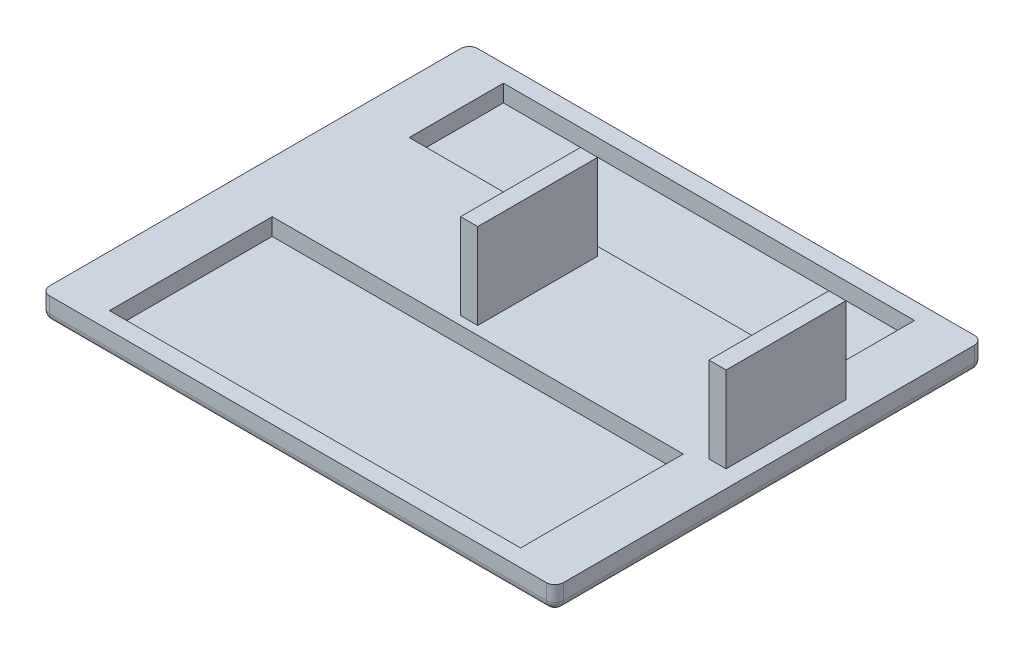
ISO-10303-21;
HEADER;
FILE_DESCRIPTION(('STEP AP214'),'2;1');
FILE_NAME('part.step','',(''),(''),'','','');
FILE_SCHEMA(('AUTOMOTIVE_DESIGN { 1 0 10303 214 1 1 1 1 }'));
ENDSEC;
DATA;
#1=APPLICATION_CONTEXT('core data for automotive mechanical design processes');
#2=APPLICATION_PROTOCOL_DEFINITION('international standard','automotive_design',2000,#1);
#3=PRODUCT_CONTEXT('',#1,'mechanical');
#4=PRODUCT('Part','Part','',(#3));
#5=PRODUCT_RELATED_PRODUCT_CATEGORY('part','',(#4));
#6=PRODUCT_DEFINITION_FORMATION('','',#4);
#7=PRODUCT_DEFINITION_CONTEXT('part definition',#1,'design');
#8=PRODUCT_DEFINITION('design','',#6,#7);
#9=PRODUCT_DEFINITION_SHAPE('','',#8);
#10=(LENGTH_UNIT() NAMED_UNIT(*) SI_UNIT(.MILLI.,.METRE.));
#11=(NAMED_UNIT(*) PLANE_ANGLE_UNIT() SI_UNIT($,.RADIAN.));
#12=(NAMED_UNIT(*) SI_UNIT($,.STERADIAN.) SOLID_ANGLE_UNIT());
#13=UNCERTAINTY_MEASURE_WITH_UNIT(LENGTH_MEASURE(1.E-05),#10,'distance_accuracy_value','');
#14=(GEOMETRIC_REPRESENTATION_CONTEXT(3) GLOBAL_UNCERTAINTY_ASSIGNED_CONTEXT((#13)) GLOBAL_UNIT_ASSIGNED_CONTEXT((#10,
#11,#12)) REPRESENTATION_CONTEXT('',''));
#15=CARTESIAN_POINT('',(0.,0.,0.));
#16=DIRECTION('',(0.,0.,1.));
#17=DIRECTION('',(1.,0.,0.));
#18=AXIS2_PLACEMENT_3D('',#15,#16,#17);
#19=CARTESIAN_POINT('',(0.,14.,0.));
#20=DIRECTION('',(0.,-1.,0.));
#21=DIRECTION('',(0.,0.,-1.));
#22=AXIS2_PLACEMENT_3D('',#19,#20,#21);
#23=PLANE('',#22);
#24=DIRECTION('',(0.,0.,1.));
#25=VECTOR('',#24,1.);
#26=CARTESIAN_POINT('',(130.,14.,-55.));
#27=LINE('',#26,#25);
#28=CARTESIAN_POINT('',(130.,14.,-55.));
#29=VERTEX_POINT('',#28);
#30=CARTESIAN_POINT('',(130.,14.,15.));
#31=VERTEX_POINT('',#30);
#32=EDGE_CURVE('E230',#29,#31,#27,.T.);
#33=ORIENTED_EDGE('',*,*,#32,.F.);
#34=DIRECTION('',(-1.,0.,0.));
#35=VECTOR('',#34,1.);
#36=CARTESIAN_POINT('',(130.,14.,-55.));
#37=LINE('',#36,#35);
#38=CARTESIAN_POINT('',(140.,14.,-55.));
#39=VERTEX_POINT('',#38);
#40=EDGE_CURVE('E243',#39,#29,#37,.T.);
#41=ORIENTED_EDGE('',*,*,#40,.F.);
#42=DIRECTION('',(0.,0.,-1.));
#43=VECTOR('',#42,1.);
#44=CARTESIAN_POINT('',(140.,14.,-55.));
#45=LINE('',#44,#43);
#46=CARTESIAN_POINT('',(140.,14.,15.));
#47=VERTEX_POINT('',#46);
#48=EDGE_CURVE('E252',#47,#39,#45,.T.);
#49=ORIENTED_EDGE('',*,*,#48,.F.);
#50=DIRECTION('',(1.,0.,0.));
#51=VECTOR('',#50,1.);
#52=CARTESIAN_POINT('',(130.,14.,15.));
#53=LINE('',#52,#51);
#54=EDGE_CURVE('E233',#31,#47,#53,.T.);
#55=ORIENTED_EDGE('',*,*,#54,.F.);
#56=EDGE_LOOP('',(#33,#41,#49,#55));
#57=FACE_BOUND('',#56,.T.);
#58=DIRECTION('',(0.,0.,-1.));
#59=VECTOR('',#58,1.);
#60=CARTESIAN_POINT('',(120.,14.,-115.));
#61=LINE('',#60,#59);
#62=CARTESIAN_POINT('',(120.,14.,-60.));
#63=VERTEX_POINT('',#62);
#64=CARTESIAN_POINT('',(120.,14.,-115.));
#65=VERTEX_POINT('',#64);
#66=EDGE_CURVE('E315',#63,#65,#61,.T.);
#67=ORIENTED_EDGE('',*,*,#66,.F.);
#68=DIRECTION('',(-1.,0.,0.));
#69=VECTOR('',#68,1.);
#70=CARTESIAN_POINT('',(-120.,14.,-60.));
#71=LINE('',#70,#69);
#72=CARTESIAN_POINT('',(-120.,14.,-60.));
#73=VERTEX_POINT('',#72);
#74=EDGE_CURVE('E272',#63,#73,#71,.T.);
#75=ORIENTED_EDGE('',*,*,#74,.T.);
#76=DIRECTION('',(0.,0.,1.));
#77=VECTOR('',#76,1.);
#78=CARTESIAN_POINT('',(-120.,14.,-115.));
#79=LINE('',#78,#77);
#80=CARTESIAN_POINT('',(-120.,14.,-115.));
#81=VERTEX_POINT('',#80);
#82=EDGE_CURVE('E310',#81,#73,#79,.T.);
#83=ORIENTED_EDGE('',*,*,#82,.F.);
#84=DIRECTION('',(-1.,0.,0.));
#85=VECTOR('',#84,1.);
#86=CARTESIAN_POINT('',(-120.,14.,-115.));
#87=LINE('',#86,#85);
#88=EDGE_CURVE('E306',#65,#81,#87,.T.);
#89=ORIENTED_EDGE('',*,*,#88,.F.);
#90=EDGE_LOOP('',(#67,#75,#83,#89));
#91=FACE_BOUND('',#90,.T.);
#92=DIRECTION('',(1.,0.,0.));
#93=VECTOR('',#92,1.);
#94=CARTESIAN_POINT('',(-120.,14.,20.));
#95=LINE('',#94,#93);
#96=CARTESIAN_POINT('',(-120.,14.,20.));
#97=VERTEX_POINT('',#96);
#98=CARTESIAN_POINT('',(120.,14.,20.));
#99=VERTEX_POINT('',#98);
#100=EDGE_CURVE('E269',#97,#99,#95,.T.);
#101=ORIENTED_EDGE('',*,*,#100,.T.);
#102=CARTESIAN_POINT('',(120.,14.,115.));
#103=VERTEX_POINT('',#102);
#104=EDGE_CURVE('E295',#103,#99,#61,.T.);
#105=ORIENTED_EDGE('',*,*,#104,.F.);
#106=DIRECTION('',(1.,0.,0.));
#107=VECTOR('',#106,1.);
#108=CARTESIAN_POINT('',(-120.,14.,115.));
#109=LINE('',#108,#107);
#110=CARTESIAN_POINT('',(-120.,14.,115.));
#111=VERTEX_POINT('',#110);
#112=EDGE_CURVE('E312',#111,#103,#109,.T.);
#113=ORIENTED_EDGE('',*,*,#112,.F.);
#114=EDGE_CURVE('E308',#97,#111,#79,.T.);
#115=ORIENTED_EDGE('',*,*,#114,.F.);
#116=EDGE_LOOP('',(#101,#105,#113,#115));
#117=FACE_BOUND('',#116,.T.);
#118=DIRECTION('',(0.,0.,-1.));
#119=VECTOR('',#118,1.);
#120=CARTESIAN_POINT('',(150.,14.,125.));
#121=LINE('',#120,#119);
#122=CARTESIAN_POINT('',(150.,14.,120.));
#123=VERTEX_POINT('',#122);
#124=CARTESIAN_POINT('',(150.,14.,-120.));
#125=VERTEX_POINT('',#124);
#126=EDGE_CURVE('E320',#123,#125,#121,.T.);
#127=ORIENTED_EDGE('',*,*,#126,.T.);
#128=CARTESIAN_POINT('',(145.,14.,-120.));
#129=DIRECTION('',(0.,-1.,0.));
#130=DIRECTION('',(0.,0.,-1.));
#131=AXIS2_PLACEMENT_3D('',#128,#129,#130);
#132=CIRCLE('',#131,5.);
#133=CARTESIAN_POINT('',(145.,14.,-125.));
#134=VERTEX_POINT('',#133);
#135=EDGE_CURVE('E397',#125,#134,#132,.F.);
#136=ORIENTED_EDGE('',*,*,#135,.T.);
#137=DIRECTION('',(-1.,0.,0.));
#138=VECTOR('',#137,1.);
#139=CARTESIAN_POINT('',(-150.,14.,-125.));
#140=LINE('',#139,#138);
#141=CARTESIAN_POINT('',(-145.,14.,-125.));
#142=VERTEX_POINT('',#141);
#143=EDGE_CURVE('E330',#134,#142,#140,.T.);
#144=ORIENTED_EDGE('',*,*,#143,.T.);
#145=CARTESIAN_POINT('',(-145.,14.,-120.));
#146=DIRECTION('',(0.,-1.,0.));
#147=DIRECTION('',(0.,0.,-1.));
#148=AXIS2_PLACEMENT_3D('',#145,#146,#147);
#149=CIRCLE('',#148,5.);
#150=CARTESIAN_POINT('',(-150.,14.,-120.));
#151=VERTEX_POINT('',#150);
#152=EDGE_CURVE('E393',#142,#151,#149,.F.);
#153=ORIENTED_EDGE('',*,*,#152,.T.);
#154=DIRECTION('',(0.,0.,1.));
#155=VECTOR('',#154,1.);
#156=CARTESIAN_POINT('',(-150.,14.,125.));
#157=LINE('',#156,#155);
#158=CARTESIAN_POINT('',(-150.,14.,120.));
#159=VERTEX_POINT('',#158);
#160=EDGE_CURVE('E333',#151,#159,#157,.T.);
#161=ORIENTED_EDGE('',*,*,#160,.T.);
#162=CARTESIAN_POINT('',(-145.,14.,120.));
#163=DIRECTION('',(0.,-1.,0.));
#164=DIRECTION('',(0.,0.,-1.));
#165=AXIS2_PLACEMENT_3D('',#162,#163,#164);
#166=CIRCLE('',#165,5.);
#167=CARTESIAN_POINT('',(-145.,14.,125.));
#168=VERTEX_POINT('',#167);
#169=EDGE_CURVE('E391',#159,#168,#166,.F.);
#170=ORIENTED_EDGE('',*,*,#169,.T.);
#171=DIRECTION('',(1.,0.,0.));
#172=VECTOR('',#171,1.);
#173=CARTESIAN_POINT('',(-150.,14.,125.));
#174=LINE('',#173,#172);
#175=CARTESIAN_POINT('',(145.,14.,125.));
#176=VERTEX_POINT('',#175);
#177=EDGE_CURVE('E336',#168,#176,#174,.T.);
#178=ORIENTED_EDGE('',*,*,#177,.T.);
#179=CARTESIAN_POINT('',(145.,14.,120.));
#180=DIRECTION('',(0.,-1.,0.));
#181=DIRECTION('',(0.,0.,-1.));
#182=AXIS2_PLACEMENT_3D('',#179,#180,#181);
#183=CIRCLE('',#182,5.);
#184=EDGE_CURVE('E395',#176,#123,#183,.F.);
#185=ORIENTED_EDGE('',*,*,#184,.T.);
#186=EDGE_LOOP('',(#127,#136,#144,#153,#161,#170,#178,#185));
#187=FACE_BOUND('',#186,.T.);
#188=DIRECTION('',(0.,0.,1.));
#189=VECTOR('',#188,1.);
#190=CARTESIAN_POINT('',(-15.0000000000001,14.,-55.));
#191=LINE('',#190,#189);
#192=CARTESIAN_POINT('',(-15.0000000000001,14.,-55.));
#193=VERTEX_POINT('',#192);
#194=CARTESIAN_POINT('',(-15.0000000000001,14.,15.));
#195=VERTEX_POINT('',#194);
#196=EDGE_CURVE('E229',#193,#195,#191,.T.);
#197=ORIENTED_EDGE('',*,*,#196,.F.);
#198=DIRECTION('',(-1.,0.,0.));
#199=VECTOR('',#198,1.);
#200=CARTESIAN_POINT('',(-15.0000000000001,14.,-55.));
#201=LINE('',#200,#199);
#202=CARTESIAN_POINT('',(-5.00000000000005,14.,-55.));
#203=VERTEX_POINT('',#202);
#204=EDGE_CURVE('E226',#203,#193,#201,.T.);
#205=ORIENTED_EDGE('',*,*,#204,.F.);
#206=DIRECTION('',(0.,0.,-1.));
#207=VECTOR('',#206,1.);
#208=CARTESIAN_POINT('',(-5.00000000000005,14.,-55.));
#209=LINE('',#208,#207);
#210=CARTESIAN_POINT('',(-5.00000000000005,14.,15.));
#211=VERTEX_POINT('',#210);
#212=EDGE_CURVE('E57',#211,#203,#209,.T.);
#213=ORIENTED_EDGE('',*,*,#212,.F.);
#214=DIRECTION('',(1.,0.,0.));
#215=VECTOR('',#214,1.);
#216=CARTESIAN_POINT('',(-15.0000000000001,14.,15.));
#217=LINE('',#216,#215);
#218=EDGE_CURVE('E52',#195,#211,#217,.T.);
#219=ORIENTED_EDGE('',*,*,#218,.F.);
#220=EDGE_LOOP('',(#197,#205,#213,#219));
#221=FACE_BOUND('',#220,.T.);
#222=ADVANCED_FACE('F35',(#57,#91,#117,#187,#221),#23,.F.);
#223=CARTESIAN_POINT('',(120.,4.,-115.));
#224=DIRECTION('',(1.,0.,0.));
#225=DIRECTION('',(0.,0.,-1.));
#226=AXIS2_PLACEMENT_3D('',#223,#224,#225);
#227=PLANE('',#226);
#228=DIRECTION('',(0.,-1.,0.));
#229=VECTOR('',#228,1.);
#230=CARTESIAN_POINT('',(120.,14.,20.));
#231=LINE('',#230,#229);
#232=CARTESIAN_POINT('',(120.,4.,20.));
#233=VERTEX_POINT('',#232);
#234=EDGE_CURVE('E286',#99,#233,#231,.T.);
#235=ORIENTED_EDGE('',*,*,#234,.T.);
#236=DIRECTION('',(0.,0.,-1.));
#237=VECTOR('',#236,1.);
#238=CARTESIAN_POINT('',(120.,4.,-115.));
#239=LINE('',#238,#237);
#240=CARTESIAN_POINT('',(120.,4.,115.));
#241=VERTEX_POINT('',#240);
#242=EDGE_CURVE('E302',#241,#233,#239,.T.);
#243=ORIENTED_EDGE('',*,*,#242,.F.);
#244=DIRECTION('',(0.,1.,0.));
#245=VECTOR('',#244,1.);
#246=CARTESIAN_POINT('',(120.,4.,115.));
#247=LINE('',#246,#245);
#248=EDGE_CURVE('E321',#241,#103,#247,.T.);
#249=ORIENTED_EDGE('',*,*,#248,.T.);
#250=ORIENTED_EDGE('',*,*,#104,.T.);
#251=EDGE_LOOP('',(#235,#243,#249,#250));
#252=FACE_BOUND('',#251,.T.);
#253=ADVANCED_FACE('F483',(#252),#227,.F.);
#254=DIRECTION('',(0.,-1.,0.));
#255=VECTOR('',#254,1.);
#256=CARTESIAN_POINT('',(120.,14.,-60.));
#257=LINE('',#256,#255);
#258=CARTESIAN_POINT('',(120.,4.,-60.));
#259=VERTEX_POINT('',#258);
#260=EDGE_CURVE('E283',#63,#259,#257,.T.);
#261=ORIENTED_EDGE('',*,*,#260,.F.);
#262=ORIENTED_EDGE('',*,*,#66,.T.);
#263=DIRECTION('',(0.,1.,0.));
#264=VECTOR('',#263,1.);
#265=CARTESIAN_POINT('',(120.,4.,-115.));
#266=LINE('',#265,#264);
#267=CARTESIAN_POINT('',(120.,4.,-115.));
#268=VERTEX_POINT('',#267);
#269=EDGE_CURVE('E317',#268,#65,#266,.T.);
#270=ORIENTED_EDGE('',*,*,#269,.F.);
#271=EDGE_CURVE('E301',#259,#268,#239,.T.);
#272=ORIENTED_EDGE('',*,*,#271,.F.);
#273=EDGE_LOOP('',(#261,#262,#270,#272));
#274=FACE_BOUND('',#273,.T.);
#275=ADVANCED_FACE('F489',(#274),#227,.F.);
#276=CARTESIAN_POINT('',(-120.,4.,-115.));
#277=DIRECTION('',(-1.,0.,0.));
#278=DIRECTION('',(0.,0.,1.));
#279=AXIS2_PLACEMENT_3D('',#276,#277,#278);
#280=PLANE('',#279);
#281=DIRECTION('',(0.,-1.,0.));
#282=VECTOR('',#281,1.);
#283=CARTESIAN_POINT('',(-120.,14.,20.));
#284=LINE('',#283,#282);
#285=CARTESIAN_POINT('',(-120.,4.,20.));
#286=VERTEX_POINT('',#285);
#287=EDGE_CURVE('E288',#97,#286,#284,.T.);
#288=ORIENTED_EDGE('',*,*,#287,.F.);
#289=ORIENTED_EDGE('',*,*,#114,.T.);
#290=DIRECTION('',(0.,1.,0.));
#291=VECTOR('',#290,1.);
#292=CARTESIAN_POINT('',(-120.,4.,115.));
#293=LINE('',#292,#291);
#294=CARTESIAN_POINT('',(-120.,4.,115.));
#295=VERTEX_POINT('',#294);
#296=EDGE_CURVE('E323',#295,#111,#293,.T.);
#297=ORIENTED_EDGE('',*,*,#296,.F.);
#298=DIRECTION('',(0.,0.,1.));
#299=VECTOR('',#298,1.);
#300=CARTESIAN_POINT('',(-120.,4.,-115.));
#301=LINE('',#300,#299);
#302=EDGE_CURVE('E294',#286,#295,#301,.T.);
#303=ORIENTED_EDGE('',*,*,#302,.F.);
#304=EDGE_LOOP('',(#288,#289,#297,#303));
#305=FACE_BOUND('',#304,.T.);
#306=ADVANCED_FACE('F587',(#305),#280,.F.);
#307=DIRECTION('',(0.,-1.,0.));
#308=VECTOR('',#307,1.);
#309=CARTESIAN_POINT('',(-120.,14.,-60.));
#310=LINE('',#309,#308);
#311=CARTESIAN_POINT('',(-120.,4.,-60.));
#312=VERTEX_POINT('',#311);
#313=EDGE_CURVE('E276',#73,#312,#310,.T.);
#314=ORIENTED_EDGE('',*,*,#313,.T.);
#315=CARTESIAN_POINT('',(-120.,4.,-115.));
#316=VERTEX_POINT('',#315);
#317=EDGE_CURVE('E296',#316,#312,#301,.T.);
#318=ORIENTED_EDGE('',*,*,#317,.F.);
#319=DIRECTION('',(0.,1.,0.));
#320=VECTOR('',#319,1.);
#321=CARTESIAN_POINT('',(-120.,4.,-115.));
#322=LINE('',#321,#320);
#323=EDGE_CURVE('E305',#316,#81,#322,.T.);
#324=ORIENTED_EDGE('',*,*,#323,.T.);
#325=ORIENTED_EDGE('',*,*,#82,.T.);
#326=EDGE_LOOP('',(#314,#318,#324,#325));
#327=FACE_BOUND('',#326,.T.);
#328=ADVANCED_FACE('F596',(#327),#280,.F.);
#329=CARTESIAN_POINT('',(0.,4.,0.));
#330=DIRECTION('',(0.,-1.,0.));
#331=DIRECTION('',(0.,0.,-1.));
#332=AXIS2_PLACEMENT_3D('',#329,#330,#331);
#333=PLANE('',#332);
#334=DIRECTION('',(1.,0.,0.));
#335=VECTOR('',#334,1.);
#336=CARTESIAN_POINT('',(-120.,4.,20.));
#337=LINE('',#336,#335);
#338=EDGE_CURVE('E268',#286,#233,#337,.T.);
#339=ORIENTED_EDGE('',*,*,#338,.F.);
#340=ORIENTED_EDGE('',*,*,#302,.T.);
#341=DIRECTION('',(1.,0.,0.));
#342=VECTOR('',#341,1.);
#343=CARTESIAN_POINT('',(-120.,4.,115.));
#344=LINE('',#343,#342);
#345=EDGE_CURVE('E298',#295,#241,#344,.T.);
#346=ORIENTED_EDGE('',*,*,#345,.T.);
#347=ORIENTED_EDGE('',*,*,#242,.T.);
#348=EDGE_LOOP('',(#339,#340,#346,#347));
#349=FACE_BOUND('',#348,.T.);
#350=ADVANCED_FACE('F605',(#349),#333,.F.);
#351=DIRECTION('',(-1.,0.,0.));
#352=VECTOR('',#351,1.);
#353=CARTESIAN_POINT('',(-120.,4.,-60.));
#354=LINE('',#353,#352);
#355=EDGE_CURVE('E273',#259,#312,#354,.T.);
#356=ORIENTED_EDGE('',*,*,#355,.F.);
#357=ORIENTED_EDGE('',*,*,#271,.T.);
#358=DIRECTION('',(-1.,0.,0.));
#359=VECTOR('',#358,1.);
#360=CARTESIAN_POINT('',(-120.,4.,-115.));
#361=LINE('',#360,#359);
#362=EDGE_CURVE('E291',#268,#316,#361,.T.);
#363=ORIENTED_EDGE('',*,*,#362,.T.);
#364=ORIENTED_EDGE('',*,*,#317,.T.);
#365=EDGE_LOOP('',(#356,#357,#363,#364));
#366=FACE_BOUND('',#365,.T.);
#367=ADVANCED_FACE('F508',(#366),#333,.F.);
#368=CARTESIAN_POINT('',(150.,14.,125.));
#369=DIRECTION('',(-1.,0.,0.));
#370=DIRECTION('',(0.,0.,1.));
#371=AXIS2_PLACEMENT_3D('',#368,#369,#370);
#372=PLANE('',#371);
#373=DIRECTION('',(0.,0.,-1.));
#374=VECTOR('',#373,1.);
#375=CARTESIAN_POINT('',(150.,5.,-125.));
#376=LINE('',#375,#374);
#377=CARTESIAN_POINT('',(150.,5.,120.));
#378=VERTEX_POINT('',#377);
#379=CARTESIAN_POINT('',(150.,5.,-120.));
#380=VERTEX_POINT('',#379);
#381=EDGE_CURVE('E360',#378,#380,#376,.T.);
#382=ORIENTED_EDGE('',*,*,#381,.T.);
#383=DIRECTION('',(0.,-1.,0.));
#384=VECTOR('',#383,1.);
#385=CARTESIAN_POINT('',(150.,14.,-120.));
#386=LINE('',#385,#384);
#387=EDGE_CURVE('E389',#380,#125,#386,.F.);
#388=ORIENTED_EDGE('',*,*,#387,.T.);
#389=ORIENTED_EDGE('',*,*,#126,.F.);
#390=DIRECTION('',(0.,-1.,0.));
#391=VECTOR('',#390,1.);
#392=CARTESIAN_POINT('',(150.,14.,120.));
#393=LINE('',#392,#391);
#394=EDGE_CURVE('E387',#123,#378,#393,.T.);
#395=ORIENTED_EDGE('',*,*,#394,.T.);
#396=EDGE_LOOP('',(#382,#388,#389,#395));
#397=FACE_BOUND('',#396,.T.);
#398=ADVANCED_FACE('F505',(#397),#372,.F.);
#399=CARTESIAN_POINT('',(-150.,14.,-125.));
#400=DIRECTION('',(0.,0.,1.));
#401=DIRECTION('',(1.,0.,0.));
#402=AXIS2_PLACEMENT_3D('',#399,#400,#401);
#403=PLANE('',#402);
#404=ORIENTED_EDGE('',*,*,#143,.F.);
#405=DIRECTION('',(0.,-1.,0.));
#406=VECTOR('',#405,1.);
#407=CARTESIAN_POINT('',(145.,14.,-125.));
#408=LINE('',#407,#406);
#409=CARTESIAN_POINT('',(145.,5.,-125.));
#410=VERTEX_POINT('',#409);
#411=EDGE_CURVE('E385',#134,#410,#408,.T.);
#412=ORIENTED_EDGE('',*,*,#411,.T.);
#413=DIRECTION('',(-1.,0.,0.));
#414=VECTOR('',#413,1.);
#415=CARTESIAN_POINT('',(-150.,5.,-125.));
#416=LINE('',#415,#414);
#417=CARTESIAN_POINT('',(-145.,5.,-125.));
#418=VERTEX_POINT('',#417);
#419=EDGE_CURVE('E339',#410,#418,#416,.T.);
#420=ORIENTED_EDGE('',*,*,#419,.T.);
#421=DIRECTION('',(0.,-1.,0.));
#422=VECTOR('',#421,1.);
#423=CARTESIAN_POINT('',(-145.,14.,-125.));
#424=LINE('',#423,#422);
#425=EDGE_CURVE('E383',#418,#142,#424,.F.);
#426=ORIENTED_EDGE('',*,*,#425,.T.);
#427=EDGE_LOOP('',(#404,#412,#420,#426));
#428=FACE_BOUND('',#427,.T.);
#429=ADVANCED_FACE('F441',(#428),#403,.F.);
#430=CARTESIAN_POINT('',(-150.,14.,125.));
#431=DIRECTION('',(1.,0.,0.));
#432=DIRECTION('',(0.,0.,-1.));
#433=AXIS2_PLACEMENT_3D('',#430,#431,#432);
#434=PLANE('',#433);
#435=ORIENTED_EDGE('',*,*,#160,.F.);
#436=DIRECTION('',(0.,-1.,0.));
#437=VECTOR('',#436,1.);
#438=CARTESIAN_POINT('',(-150.,14.,-120.));
#439=LINE('',#438,#437);
#440=CARTESIAN_POINT('',(-150.,5.,-120.));
#441=VERTEX_POINT('',#440);
#442=EDGE_CURVE('E11',#151,#441,#439,.T.);
#443=ORIENTED_EDGE('',*,*,#442,.T.);
#444=DIRECTION('',(0.,0.,1.));
#445=VECTOR('',#444,1.);
#446=CARTESIAN_POINT('',(-150.,5.,125.));
#447=LINE('',#446,#445);
#448=CARTESIAN_POINT('',(-150.,5.,120.));
#449=VERTEX_POINT('',#448);
#450=EDGE_CURVE('E354',#441,#449,#447,.T.);
#451=ORIENTED_EDGE('',*,*,#450,.T.);
#452=DIRECTION('',(0.,-1.,0.));
#453=VECTOR('',#452,1.);
#454=CARTESIAN_POINT('',(-150.,14.,120.));
#455=LINE('',#454,#453);
#456=EDGE_CURVE('E44',#449,#159,#455,.F.);
#457=ORIENTED_EDGE('',*,*,#456,.T.);
#458=EDGE_LOOP('',(#435,#443,#451,#457));
#459=FACE_BOUND('',#458,.T.);
#460=ADVANCED_FACE('F429',(#459),#434,.F.);
#461=CARTESIAN_POINT('',(-150.,14.,125.));
#462=DIRECTION('',(0.,0.,-1.));
#463=DIRECTION('',(-1.,0.,0.));
#464=AXIS2_PLACEMENT_3D('',#461,#462,#463);
#465=PLANE('',#464);
#466=DIRECTION('',(1.,0.,0.));
#467=VECTOR('',#466,1.);
#468=CARTESIAN_POINT('',(150.,5.,125.));
#469=LINE('',#468,#467);
#470=CARTESIAN_POINT('',(-145.,5.,125.));
#471=VERTEX_POINT('',#470);
#472=CARTESIAN_POINT('',(145.,5.,125.));
#473=VERTEX_POINT('',#472);
#474=EDGE_CURVE('E357',#471,#473,#469,.T.);
#475=ORIENTED_EDGE('',*,*,#474,.T.);
#476=DIRECTION('',(0.,-1.,0.));
#477=VECTOR('',#476,1.);
#478=CARTESIAN_POINT('',(145.,14.,125.));
#479=LINE('',#478,#477);
#480=EDGE_CURVE('E401',#473,#176,#479,.F.);
#481=ORIENTED_EDGE('',*,*,#480,.T.);
#482=ORIENTED_EDGE('',*,*,#177,.F.);
#483=DIRECTION('',(0.,-1.,0.));
#484=VECTOR('',#483,1.);
#485=CARTESIAN_POINT('',(-145.,14.,125.));
#486=LINE('',#485,#484);
#487=EDGE_CURVE('E399',#168,#471,#486,.T.);
#488=ORIENTED_EDGE('',*,*,#487,.T.);
#489=EDGE_LOOP('',(#475,#481,#482,#488));
#490=FACE_BOUND('',#489,.T.);
#491=ADVANCED_FACE('F463',(#490),#465,.F.);
#492=CARTESIAN_POINT('',(0.,0.,0.));
#493=DIRECTION('',(0.,-1.,0.));
#494=DIRECTION('',(0.,0.,-1.));
#495=AXIS2_PLACEMENT_3D('',#492,#493,#494);
#496=PLANE('',#495);
#497=DIRECTION('',(0.,0.,1.));
#498=VECTOR('',#497,1.);
#499=CARTESIAN_POINT('',(-145.,0.,-125.));
#500=LINE('',#499,#498);
#501=CARTESIAN_POINT('',(-145.,0.,120.));
#502=VERTEX_POINT('',#501);
#503=CARTESIAN_POINT('',(-145.,0.,-120.));
#504=VERTEX_POINT('',#503);
#505=EDGE_CURVE('E348',#502,#504,#500,.F.);
#506=ORIENTED_EDGE('',*,*,#505,.T.);
#507=DIRECTION('',(-1.,0.,0.));
#508=VECTOR('',#507,1.);
#509=CARTESIAN_POINT('',(150.,0.,-120.));
#510=LINE('',#509,#508);
#511=CARTESIAN_POINT('',(145.,0.,-120.));
#512=VERTEX_POINT('',#511);
#513=EDGE_CURVE('E351',#504,#512,#510,.F.);
#514=ORIENTED_EDGE('',*,*,#513,.T.);
#515=DIRECTION('',(0.,0.,-1.));
#516=VECTOR('',#515,1.);
#517=CARTESIAN_POINT('',(145.,0.,125.));
#518=LINE('',#517,#516);
#519=CARTESIAN_POINT('',(145.,0.,120.));
#520=VERTEX_POINT('',#519);
#521=EDGE_CURVE('E342',#512,#520,#518,.F.);
#522=ORIENTED_EDGE('',*,*,#521,.T.);
#523=DIRECTION('',(1.,0.,0.));
#524=VECTOR('',#523,1.);
#525=CARTESIAN_POINT('',(-150.,0.,120.));
#526=LINE('',#525,#524);
#527=EDGE_CURVE('E345',#520,#502,#526,.F.);
#528=ORIENTED_EDGE('',*,*,#527,.T.);
#529=EDGE_LOOP('',(#506,#514,#522,#528));
#530=FACE_BOUND('',#529,.T.);
#531=ADVANCED_FACE('F457',(#530),#496,.T.);
#532=CARTESIAN_POINT('',(-120.,4.,-115.));
#533=DIRECTION('',(0.,0.,-1.));
#534=DIRECTION('',(-1.,0.,0.));
#535=AXIS2_PLACEMENT_3D('',#532,#533,#534);
#536=PLANE('',#535);
#537=ORIENTED_EDGE('',*,*,#88,.T.);
#538=ORIENTED_EDGE('',*,*,#323,.F.);
#539=ORIENTED_EDGE('',*,*,#362,.F.);
#540=ORIENTED_EDGE('',*,*,#269,.T.);
#541=EDGE_LOOP('',(#537,#538,#539,#540));
#542=FACE_BOUND('',#541,.T.);
#543=ADVANCED_FACE('F495',(#542),#536,.F.);
#544=CARTESIAN_POINT('',(-120.,4.,115.));
#545=DIRECTION('',(0.,0.,1.));
#546=DIRECTION('',(1.,0.,0.));
#547=AXIS2_PLACEMENT_3D('',#544,#545,#546);
#548=PLANE('',#547);
#549=ORIENTED_EDGE('',*,*,#112,.T.);
#550=ORIENTED_EDGE('',*,*,#248,.F.);
#551=ORIENTED_EDGE('',*,*,#345,.F.);
#552=ORIENTED_EDGE('',*,*,#296,.T.);
#553=EDGE_LOOP('',(#549,#550,#551,#552));
#554=FACE_BOUND('',#553,.T.);
#555=ADVANCED_FACE('F518',(#554),#548,.F.);
#556=CARTESIAN_POINT('',(-150.,5.,120.));
#557=DIRECTION('',(-1.,0.,0.));
#558=DIRECTION('',(0.,0.,1.));
#559=AXIS2_PLACEMENT_3D('',#556,#557,#558);
#560=CYLINDRICAL_SURFACE('',#559,5.);
#561=ORIENTED_EDGE('',*,*,#527,.F.);
#562=CARTESIAN_POINT('',(145.,5.,120.));
#563=DIRECTION('',(-1.,0.,0.));
#564=DIRECTION('',(0.,0.,1.));
#565=AXIS2_PLACEMENT_3D('',#562,#563,#564);
#566=CIRCLE('',#565,5.);
#567=EDGE_CURVE('E376',#520,#473,#566,.T.);
#568=ORIENTED_EDGE('',*,*,#567,.T.);
#569=ORIENTED_EDGE('',*,*,#474,.F.);
#570=CARTESIAN_POINT('',(-145.,5.,120.));
#571=DIRECTION('',(-1.,0.,0.));
#572=DIRECTION('',(0.,0.,1.));
#573=AXIS2_PLACEMENT_3D('',#570,#571,#572);
#574=CIRCLE('',#573,5.);
#575=EDGE_CURVE('E374',#471,#502,#574,.F.);
#576=ORIENTED_EDGE('',*,*,#575,.T.);
#577=EDGE_LOOP('',(#561,#568,#569,#576));
#578=FACE_BOUND('',#577,.T.);
#579=ADVANCED_FACE('F459',(#578),#560,.T.);
#580=CARTESIAN_POINT('',(145.,5.,125.));
#581=DIRECTION('',(0.,0.,1.));
#582=DIRECTION('',(1.,0.,0.));
#583=AXIS2_PLACEMENT_3D('',#580,#581,#582);
#584=CYLINDRICAL_SURFACE('',#583,5.);
#585=ORIENTED_EDGE('',*,*,#521,.F.);
#586=CARTESIAN_POINT('',(145.,5.,-120.));
#587=DIRECTION('',(0.,0.,1.));
#588=DIRECTION('',(1.,0.,0.));
#589=AXIS2_PLACEMENT_3D('',#586,#587,#588);
#590=CIRCLE('',#589,5.);
#591=EDGE_CURVE('E372',#512,#380,#590,.T.);
#592=ORIENTED_EDGE('',*,*,#591,.T.);
#593=ORIENTED_EDGE('',*,*,#381,.F.);
#594=CARTESIAN_POINT('',(145.,5.,120.));
#595=DIRECTION('',(0.,0.,1.));
#596=DIRECTION('',(1.,0.,0.));
#597=AXIS2_PLACEMENT_3D('',#594,#595,#596);
#598=CIRCLE('',#597,5.);
#599=EDGE_CURVE('E369',#378,#520,#598,.F.);
#600=ORIENTED_EDGE('',*,*,#599,.T.);
#601=EDGE_LOOP('',(#585,#592,#593,#600));
#602=FACE_BOUND('',#601,.T.);
#603=ADVANCED_FACE('F452',(#602),#584,.T.);
#604=CARTESIAN_POINT('',(-145.,5.,125.));
#605=DIRECTION('',(0.,0.,-1.));
#606=DIRECTION('',(-1.,0.,0.));
#607=AXIS2_PLACEMENT_3D('',#604,#605,#606);
#608=CYLINDRICAL_SURFACE('',#607,5.);
#609=ORIENTED_EDGE('',*,*,#450,.F.);
#610=CARTESIAN_POINT('',(-145.,5.,-120.));
#611=DIRECTION('',(0.,0.,-1.));
#612=DIRECTION('',(-1.,0.,0.));
#613=AXIS2_PLACEMENT_3D('',#610,#611,#612);
#614=CIRCLE('',#613,5.);
#615=EDGE_CURVE('E381',#441,#504,#614,.F.);
#616=ORIENTED_EDGE('',*,*,#615,.T.);
#617=ORIENTED_EDGE('',*,*,#505,.F.);
#618=CARTESIAN_POINT('',(-145.,5.,120.));
#619=DIRECTION('',(0.,0.,-1.));
#620=DIRECTION('',(-1.,0.,0.));
#621=AXIS2_PLACEMENT_3D('',#618,#619,#620);
#622=CIRCLE('',#621,5.);
#623=EDGE_CURVE('E378',#502,#449,#622,.T.);
#624=ORIENTED_EDGE('',*,*,#623,.T.);
#625=EDGE_LOOP('',(#609,#616,#617,#624));
#626=FACE_BOUND('',#625,.T.);
#627=ADVANCED_FACE('F428',(#626),#608,.T.);
#628=CARTESIAN_POINT('',(-150.,5.,-120.));
#629=DIRECTION('',(1.,0.,0.));
#630=DIRECTION('',(0.,0.,-1.));
#631=AXIS2_PLACEMENT_3D('',#628,#629,#630);
#632=CYLINDRICAL_SURFACE('',#631,5.);
#633=ORIENTED_EDGE('',*,*,#419,.F.);
#634=CARTESIAN_POINT('',(145.,5.,-120.));
#635=DIRECTION('',(1.,0.,0.));
#636=DIRECTION('',(0.,0.,-1.));
#637=AXIS2_PLACEMENT_3D('',#634,#635,#636);
#638=CIRCLE('',#637,5.);
#639=EDGE_CURVE('E366',#410,#512,#638,.F.);
#640=ORIENTED_EDGE('',*,*,#639,.T.);
#641=ORIENTED_EDGE('',*,*,#513,.F.);
#642=CARTESIAN_POINT('',(-145.,5.,-120.));
#643=DIRECTION('',(1.,0.,0.));
#644=DIRECTION('',(0.,0.,-1.));
#645=AXIS2_PLACEMENT_3D('',#642,#643,#644);
#646=CIRCLE('',#645,5.);
#647=EDGE_CURVE('E363',#504,#418,#646,.T.);
#648=ORIENTED_EDGE('',*,*,#647,.T.);
#649=EDGE_LOOP('',(#633,#640,#641,#648));
#650=FACE_BOUND('',#649,.T.);
#651=ADVANCED_FACE('F439',(#650),#632,.T.);
#652=CARTESIAN_POINT('',(145.,14.,-120.));
#653=DIRECTION('',(0.,-1.,0.));
#654=DIRECTION('',(0.,0.,-1.));
#655=AXIS2_PLACEMENT_3D('',#652,#653,#654);
#656=CYLINDRICAL_SURFACE('',#655,5.);
#657=ORIENTED_EDGE('',*,*,#135,.F.);
#658=ORIENTED_EDGE('',*,*,#387,.F.);
#659=CARTESIAN_POINT('',(145.,5.,-120.));
#660=DIRECTION('',(0.,-1.,0.));
#661=DIRECTION('',(0.,0.,-1.));
#662=AXIS2_PLACEMENT_3D('',#659,#660,#661);
#663=CIRCLE('',#662,5.);
#664=EDGE_CURVE('E309',#410,#380,#663,.T.);
#665=ORIENTED_EDGE('',*,*,#664,.F.);
#666=ORIENTED_EDGE('',*,*,#411,.F.);
#667=EDGE_LOOP('',(#657,#658,#665,#666));
#668=FACE_BOUND('',#667,.T.);
#669=ADVANCED_FACE('F445',(#668),#656,.T.);
#670=CARTESIAN_POINT('',(145.,5.,-120.));
#671=DIRECTION('',(0.,0.,1.));
#672=DIRECTION('',(1.,0.,0.));
#673=AXIS2_PLACEMENT_3D('',#670,#671,#672);
#674=SPHERICAL_SURFACE('',#673,5.);
#675=ORIENTED_EDGE('',*,*,#664,.T.);
#676=ORIENTED_EDGE('',*,*,#591,.F.);
#677=ORIENTED_EDGE('',*,*,#639,.F.);
#678=EDGE_LOOP('',(#675,#676,#677));
#679=FACE_BOUND('',#678,.T.);
#680=ADVANCED_FACE('F449',(#679),#674,.T.);
#681=CARTESIAN_POINT('',(145.,14.,120.));
#682=DIRECTION('',(0.,-1.,0.));
#683=DIRECTION('',(0.,0.,-1.));
#684=AXIS2_PLACEMENT_3D('',#681,#682,#683);
#685=CYLINDRICAL_SURFACE('',#684,5.);
#686=ORIENTED_EDGE('',*,*,#184,.F.);
#687=ORIENTED_EDGE('',*,*,#480,.F.);
#688=CARTESIAN_POINT('',(145.,5.,120.));
#689=DIRECTION('',(0.,-1.,0.));
#690=DIRECTION('',(0.,0.,-1.));
#691=AXIS2_PLACEMENT_3D('',#688,#689,#690);
#692=CIRCLE('',#691,5.);
#693=EDGE_CURVE('E406',#378,#473,#692,.T.);
#694=ORIENTED_EDGE('',*,*,#693,.F.);
#695=ORIENTED_EDGE('',*,*,#394,.F.);
#696=EDGE_LOOP('',(#686,#687,#694,#695));
#697=FACE_BOUND('',#696,.T.);
#698=ADVANCED_FACE('F468',(#697),#685,.T.);
#699=CARTESIAN_POINT('',(145.,5.,120.));
#700=DIRECTION('',(0.,0.,1.));
#701=DIRECTION('',(1.,0.,0.));
#702=AXIS2_PLACEMENT_3D('',#699,#700,#701);
#703=SPHERICAL_SURFACE('',#702,5.);
#704=ORIENTED_EDGE('',*,*,#693,.T.);
#705=ORIENTED_EDGE('',*,*,#567,.F.);
#706=ORIENTED_EDGE('',*,*,#599,.F.);
#707=EDGE_LOOP('',(#704,#705,#706));
#708=FACE_BOUND('',#707,.T.);
#709=ADVANCED_FACE('F471',(#708),#703,.T.);
#710=CARTESIAN_POINT('',(-145.,14.,-120.));
#711=DIRECTION('',(0.,-1.,0.));
#712=DIRECTION('',(0.,0.,-1.));
#713=AXIS2_PLACEMENT_3D('',#710,#711,#712);
#714=CYLINDRICAL_SURFACE('',#713,5.);
#715=ORIENTED_EDGE('',*,*,#152,.F.);
#716=ORIENTED_EDGE('',*,*,#425,.F.);
#717=CARTESIAN_POINT('',(-145.,5.,-120.));
#718=DIRECTION('',(0.,-1.,0.));
#719=DIRECTION('',(0.,0.,-1.));
#720=AXIS2_PLACEMENT_3D('',#717,#718,#719);
#721=CIRCLE('',#720,5.);
#722=EDGE_CURVE('E408',#441,#418,#721,.T.);
#723=ORIENTED_EDGE('',*,*,#722,.F.);
#724=ORIENTED_EDGE('',*,*,#442,.F.);
#725=EDGE_LOOP('',(#715,#716,#723,#724));
#726=FACE_BOUND('',#725,.T.);
#727=ADVANCED_FACE('F433',(#726),#714,.T.);
#728=CARTESIAN_POINT('',(-145.,5.,-120.));
#729=DIRECTION('',(0.,0.,1.));
#730=DIRECTION('',(1.,0.,0.));
#731=AXIS2_PLACEMENT_3D('',#728,#729,#730);
#732=SPHERICAL_SURFACE('',#731,5.);
#733=ORIENTED_EDGE('',*,*,#647,.F.);
#734=ORIENTED_EDGE('',*,*,#615,.F.);
#735=ORIENTED_EDGE('',*,*,#722,.T.);
#736=EDGE_LOOP('',(#733,#734,#735));
#737=FACE_BOUND('',#736,.T.);
#738=ADVANCED_FACE('F478',(#737),#732,.T.);
#739=CARTESIAN_POINT('',(-145.,14.,120.));
#740=DIRECTION('',(0.,-1.,0.));
#741=DIRECTION('',(0.,0.,-1.));
#742=AXIS2_PLACEMENT_3D('',#739,#740,#741);
#743=CYLINDRICAL_SURFACE('',#742,5.);
#744=ORIENTED_EDGE('',*,*,#169,.F.);
#745=ORIENTED_EDGE('',*,*,#456,.F.);
#746=CARTESIAN_POINT('',(-145.,5.,120.));
#747=DIRECTION('',(0.,-1.,0.));
#748=DIRECTION('',(0.,0.,-1.));
#749=AXIS2_PLACEMENT_3D('',#746,#747,#748);
#750=CIRCLE('',#749,5.);
#751=EDGE_CURVE('E39',#471,#449,#750,.T.);
#752=ORIENTED_EDGE('',*,*,#751,.F.);
#753=ORIENTED_EDGE('',*,*,#487,.F.);
#754=EDGE_LOOP('',(#744,#745,#752,#753));
#755=FACE_BOUND('',#754,.T.);
#756=ADVANCED_FACE('F37',(#755),#743,.T.);
#757=CARTESIAN_POINT('',(-145.,5.,120.));
#758=DIRECTION('',(0.,0.,1.));
#759=DIRECTION('',(1.,0.,0.));
#760=AXIS2_PLACEMENT_3D('',#757,#758,#759);
#761=SPHERICAL_SURFACE('',#760,5.);
#762=ORIENTED_EDGE('',*,*,#623,.F.);
#763=ORIENTED_EDGE('',*,*,#575,.F.);
#764=ORIENTED_EDGE('',*,*,#751,.T.);
#765=EDGE_LOOP('',(#762,#763,#764));
#766=FACE_BOUND('',#765,.T.);
#767=ADVANCED_FACE('F419',(#766),#761,.T.);
#768=CARTESIAN_POINT('',(-120.,14.,20.));
#769=DIRECTION('',(0.,0.,-1.));
#770=DIRECTION('',(-1.,0.,0.));
#771=AXIS2_PLACEMENT_3D('',#768,#769,#770);
#772=PLANE('',#771);
#773=ORIENTED_EDGE('',*,*,#338,.T.);
#774=ORIENTED_EDGE('',*,*,#234,.F.);
#775=ORIENTED_EDGE('',*,*,#100,.F.);
#776=ORIENTED_EDGE('',*,*,#287,.T.);
#777=EDGE_LOOP('',(#773,#774,#775,#776));
#778=FACE_BOUND('',#777,.T.);
#779=ADVANCED_FACE('F569',(#778),#772,.F.);
#780=CARTESIAN_POINT('',(-120.,14.,-60.));
#781=DIRECTION('',(0.,0.,1.));
#782=DIRECTION('',(1.,0.,0.));
#783=AXIS2_PLACEMENT_3D('',#780,#781,#782);
#784=PLANE('',#783);
#785=ORIENTED_EDGE('',*,*,#355,.T.);
#786=ORIENTED_EDGE('',*,*,#313,.F.);
#787=ORIENTED_EDGE('',*,*,#74,.F.);
#788=ORIENTED_EDGE('',*,*,#260,.T.);
#789=EDGE_LOOP('',(#785,#786,#787,#788));
#790=FACE_BOUND('',#789,.T.);
#791=ADVANCED_FACE('F628',(#790),#784,.F.);
#792=CARTESIAN_POINT('',(130.,64.,-55.));
#793=DIRECTION('',(1.,0.,0.));
#794=DIRECTION('',(0.,0.,-1.));
#795=AXIS2_PLACEMENT_3D('',#792,#793,#794);
#796=PLANE('',#795);
#797=ORIENTED_EDGE('',*,*,#32,.T.);
#798=DIRECTION('',(0.,-1.,0.));
#799=VECTOR('',#798,1.);
#800=CARTESIAN_POINT('',(130.,64.,15.));
#801=LINE('',#800,#799);
#802=CARTESIAN_POINT('',(130.,64.,15.));
#803=VERTEX_POINT('',#802);
#804=EDGE_CURVE('E265',#803,#31,#801,.T.);
#805=ORIENTED_EDGE('',*,*,#804,.F.);
#806=DIRECTION('',(0.,0.,1.));
#807=VECTOR('',#806,1.);
#808=CARTESIAN_POINT('',(130.,64.,-55.));
#809=LINE('',#808,#807);
#810=CARTESIAN_POINT('',(130.,64.,-55.));
#811=VERTEX_POINT('',#810);
#812=EDGE_CURVE('E239',#811,#803,#809,.T.);
#813=ORIENTED_EDGE('',*,*,#812,.F.);
#814=DIRECTION('',(0.,-1.,0.));
#815=VECTOR('',#814,1.);
#816=CARTESIAN_POINT('',(130.,64.,-55.));
#817=LINE('',#816,#815);
#818=EDGE_CURVE('E248',#811,#29,#817,.T.);
#819=ORIENTED_EDGE('',*,*,#818,.T.);
#820=EDGE_LOOP('',(#797,#805,#813,#819));
#821=FACE_BOUND('',#820,.T.);
#822=ADVANCED_FACE('F637',(#821),#796,.F.);
#823=CARTESIAN_POINT('',(130.,64.,15.));
#824=DIRECTION('',(0.,0.,-1.));
#825=DIRECTION('',(-1.,0.,0.));
#826=AXIS2_PLACEMENT_3D('',#823,#824,#825);
#827=PLANE('',#826);
#828=ORIENTED_EDGE('',*,*,#54,.T.);
#829=DIRECTION('',(0.,-1.,0.));
#830=VECTOR('',#829,1.);
#831=CARTESIAN_POINT('',(140.,64.,15.));
#832=LINE('',#831,#830);
#833=CARTESIAN_POINT('',(140.,64.,15.));
#834=VERTEX_POINT('',#833);
#835=EDGE_CURVE('E262',#834,#47,#832,.T.);
#836=ORIENTED_EDGE('',*,*,#835,.F.);
#837=DIRECTION('',(1.,0.,0.));
#838=VECTOR('',#837,1.);
#839=CARTESIAN_POINT('',(130.,64.,15.));
#840=LINE('',#839,#838);
#841=EDGE_CURVE('E242',#803,#834,#840,.T.);
#842=ORIENTED_EDGE('',*,*,#841,.F.);
#843=ORIENTED_EDGE('',*,*,#804,.T.);
#844=EDGE_LOOP('',(#828,#836,#842,#843));
#845=FACE_BOUND('',#844,.T.);
#846=ADVANCED_FACE('F653',(#845),#827,.F.);
#847=CARTESIAN_POINT('',(140.,64.,-55.));
#848=DIRECTION('',(-1.,0.,0.));
#849=DIRECTION('',(0.,0.,1.));
#850=AXIS2_PLACEMENT_3D('',#847,#848,#849);
#851=PLANE('',#850);
#852=ORIENTED_EDGE('',*,*,#48,.T.);
#853=DIRECTION('',(0.,-1.,0.));
#854=VECTOR('',#853,1.);
#855=CARTESIAN_POINT('',(140.,64.,-55.));
#856=LINE('',#855,#854);
#857=CARTESIAN_POINT('',(140.,64.,-55.));
#858=VERTEX_POINT('',#857);
#859=EDGE_CURVE('E259',#858,#39,#856,.T.);
#860=ORIENTED_EDGE('',*,*,#859,.F.);
#861=DIRECTION('',(0.,0.,-1.));
#862=VECTOR('',#861,1.);
#863=CARTESIAN_POINT('',(140.,64.,-55.));
#864=LINE('',#863,#862);
#865=EDGE_CURVE('E245',#834,#858,#864,.T.);
#866=ORIENTED_EDGE('',*,*,#865,.F.);
#867=ORIENTED_EDGE('',*,*,#835,.T.);
#868=EDGE_LOOP('',(#852,#860,#866,#867));
#869=FACE_BOUND('',#868,.T.);
#870=ADVANCED_FACE('F663',(#869),#851,.F.);
#871=CARTESIAN_POINT('',(130.,64.,-55.));
#872=DIRECTION('',(0.,0.,1.));
#873=DIRECTION('',(1.,0.,0.));
#874=AXIS2_PLACEMENT_3D('',#871,#872,#873);
#875=PLANE('',#874);
#876=ORIENTED_EDGE('',*,*,#40,.T.);
#877=ORIENTED_EDGE('',*,*,#818,.F.);
#878=DIRECTION('',(-1.,0.,0.));
#879=VECTOR('',#878,1.);
#880=CARTESIAN_POINT('',(130.,64.,-55.));
#881=LINE('',#880,#879);
#882=EDGE_CURVE('E247',#858,#811,#881,.T.);
#883=ORIENTED_EDGE('',*,*,#882,.F.);
#884=ORIENTED_EDGE('',*,*,#859,.T.);
#885=EDGE_LOOP('',(#876,#877,#883,#884));
#886=FACE_BOUND('',#885,.T.);
#887=ADVANCED_FACE('F673',(#886),#875,.F.);
#888=CARTESIAN_POINT('',(0.,64.,0.));
#889=DIRECTION('',(0.,1.,0.));
#890=DIRECTION('',(0.,0.,1.));
#891=AXIS2_PLACEMENT_3D('',#888,#889,#890);
#892=PLANE('',#891);
#893=ORIENTED_EDGE('',*,*,#812,.T.);
#894=ORIENTED_EDGE('',*,*,#841,.T.);
#895=ORIENTED_EDGE('',*,*,#865,.T.);
#896=ORIENTED_EDGE('',*,*,#882,.T.);
#897=EDGE_LOOP('',(#893,#894,#895,#896));
#898=FACE_BOUND('',#897,.T.);
#899=ADVANCED_FACE('F683',(#898),#892,.T.);
#900=CARTESIAN_POINT('',(-15.0000000000001,64.,-55.));
#901=DIRECTION('',(1.,0.,0.));
#902=DIRECTION('',(0.,0.,-1.));
#903=AXIS2_PLACEMENT_3D('',#900,#901,#902);
#904=PLANE('',#903);
#905=ORIENTED_EDGE('',*,*,#196,.T.);
#906=DIRECTION('',(0.,-1.,0.));
#907=VECTOR('',#906,1.);
#908=CARTESIAN_POINT('',(-15.0000000000001,64.,15.));
#909=LINE('',#908,#907);
#910=CARTESIAN_POINT('',(-15.0000000000001,64.,15.));
#911=VERTEX_POINT('',#910);
#912=EDGE_CURVE('E210',#911,#195,#909,.T.);
#913=ORIENTED_EDGE('',*,*,#912,.F.);
#914=DIRECTION('',(0.,0.,1.));
#915=VECTOR('',#914,1.);
#916=CARTESIAN_POINT('',(-15.0000000000001,64.,-55.));
#917=LINE('',#916,#915);
#918=CARTESIAN_POINT('',(-15.0000000000001,64.,-55.));
#919=VERTEX_POINT('',#918);
#920=EDGE_CURVE('E217',#919,#911,#917,.T.);
#921=ORIENTED_EDGE('',*,*,#920,.F.);
#922=DIRECTION('',(0.,-1.,0.));
#923=VECTOR('',#922,1.);
#924=CARTESIAN_POINT('',(-15.0000000000001,64.,-55.));
#925=LINE('',#924,#923);
#926=EDGE_CURVE('E763',#919,#193,#925,.T.);
#927=ORIENTED_EDGE('',*,*,#926,.T.);
#928=EDGE_LOOP('',(#905,#913,#921,#927));
#929=FACE_BOUND('',#928,.T.);
#930=ADVANCED_FACE('F228',(#929),#904,.F.);
#931=CARTESIAN_POINT('',(-15.0000000000001,64.,15.));
#932=DIRECTION('',(0.,0.,-1.));
#933=DIRECTION('',(-1.,0.,0.));
#934=AXIS2_PLACEMENT_3D('',#931,#932,#933);
#935=PLANE('',#934);
#936=ORIENTED_EDGE('',*,*,#218,.T.);
#937=DIRECTION('',(0.,-1.,0.));
#938=VECTOR('',#937,1.);
#939=CARTESIAN_POINT('',(-5.00000000000005,64.,15.));
#940=LINE('',#939,#938);
#941=CARTESIAN_POINT('',(-5.00000000000005,64.,15.));
#942=VERTEX_POINT('',#941);
#943=EDGE_CURVE('E213',#942,#211,#940,.T.);
#944=ORIENTED_EDGE('',*,*,#943,.F.);
#945=DIRECTION('',(1.,0.,0.));
#946=VECTOR('',#945,1.);
#947=CARTESIAN_POINT('',(-15.0000000000001,64.,15.));
#948=LINE('',#947,#946);
#949=EDGE_CURVE('E206',#911,#942,#948,.T.);
#950=ORIENTED_EDGE('',*,*,#949,.F.);
#951=ORIENTED_EDGE('',*,*,#912,.T.);
#952=EDGE_LOOP('',(#936,#944,#950,#951));
#953=FACE_BOUND('',#952,.T.);
#954=ADVANCED_FACE('F208',(#953),#935,.F.);
#955=CARTESIAN_POINT('',(-5.00000000000005,64.,-55.));
#956=DIRECTION('',(-1.,0.,0.));
#957=DIRECTION('',(0.,0.,1.));
#958=AXIS2_PLACEMENT_3D('',#955,#956,#957);
#959=PLANE('',#958);
#960=ORIENTED_EDGE('',*,*,#212,.T.);
#961=DIRECTION('',(0.,-1.,0.));
#962=VECTOR('',#961,1.);
#963=CARTESIAN_POINT('',(-5.00000000000005,64.,-55.));
#964=LINE('',#963,#962);
#965=CARTESIAN_POINT('',(-5.00000000000005,64.,-55.));
#966=VERTEX_POINT('',#965);
#967=EDGE_CURVE('E235',#966,#203,#964,.T.);
#968=ORIENTED_EDGE('',*,*,#967,.F.);
#969=DIRECTION('',(0.,0.,-1.));
#970=VECTOR('',#969,1.);
#971=CARTESIAN_POINT('',(-5.00000000000005,64.,-55.));
#972=LINE('',#971,#970);
#973=EDGE_CURVE('E216',#942,#966,#972,.T.);
#974=ORIENTED_EDGE('',*,*,#973,.F.);
#975=ORIENTED_EDGE('',*,*,#943,.T.);
#976=EDGE_LOOP('',(#960,#968,#974,#975));
#977=FACE_BOUND('',#976,.T.);
#978=ADVANCED_FACE('F710',(#977),#959,.F.);
#979=CARTESIAN_POINT('',(-15.0000000000001,64.,-55.));
#980=DIRECTION('',(0.,0.,1.));
#981=DIRECTION('',(1.,0.,0.));
#982=AXIS2_PLACEMENT_3D('',#979,#980,#981);
#983=PLANE('',#982);
#984=ORIENTED_EDGE('',*,*,#204,.T.);
#985=ORIENTED_EDGE('',*,*,#926,.F.);
#986=DIRECTION('',(-1.,0.,0.));
#987=VECTOR('',#986,1.);
#988=CARTESIAN_POINT('',(-15.0000000000001,64.,-55.));
#989=LINE('',#988,#987);
#990=EDGE_CURVE('E222',#966,#919,#989,.T.);
#991=ORIENTED_EDGE('',*,*,#990,.F.);
#992=ORIENTED_EDGE('',*,*,#967,.T.);
#993=EDGE_LOOP('',(#984,#985,#991,#992));
#994=FACE_BOUND('',#993,.T.);
#995=ADVANCED_FACE('F719',(#994),#983,.F.);
#996=CARTESIAN_POINT('',(0.,64.,0.));
#997=DIRECTION('',(0.,1.,0.));
#998=DIRECTION('',(0.,0.,1.));
#999=AXIS2_PLACEMENT_3D('',#996,#997,#998);
#1000=PLANE('',#999);
#1001=ORIENTED_EDGE('',*,*,#920,.T.);
#1002=ORIENTED_EDGE('',*,*,#949,.T.);
#1003=ORIENTED_EDGE('',*,*,#973,.T.);
#1004=ORIENTED_EDGE('',*,*,#990,.T.);
#1005=EDGE_LOOP('',(#1001,#1002,#1003,#1004));
#1006=FACE_BOUND('',#1005,.T.);
#1007=ADVANCED_FACE('F220',(#1006),#1000,.T.);
#1008=CLOSED_SHELL('',(#222,#253,#275,#306,#328,#350,#367,#398,#429,#460,#491,#531,#543,#555,
#579,#603,#627,#651,#669,#680,#698,#709,#727,#738,#756,#767,#779,#791,#822,#846,#870,#887,#899,
#930,#954,#978,#995,#1007));
#1009=MANIFOLD_SOLID_BREP('B2',#1008);
#1010=ADVANCED_BREP_SHAPE_REPRESENTATION('',(#18,#1009),#14);
#1011=SHAPE_DEFINITION_REPRESENTATION(#9,#1010);
ENDSEC;
END-ISO-10303-21;
